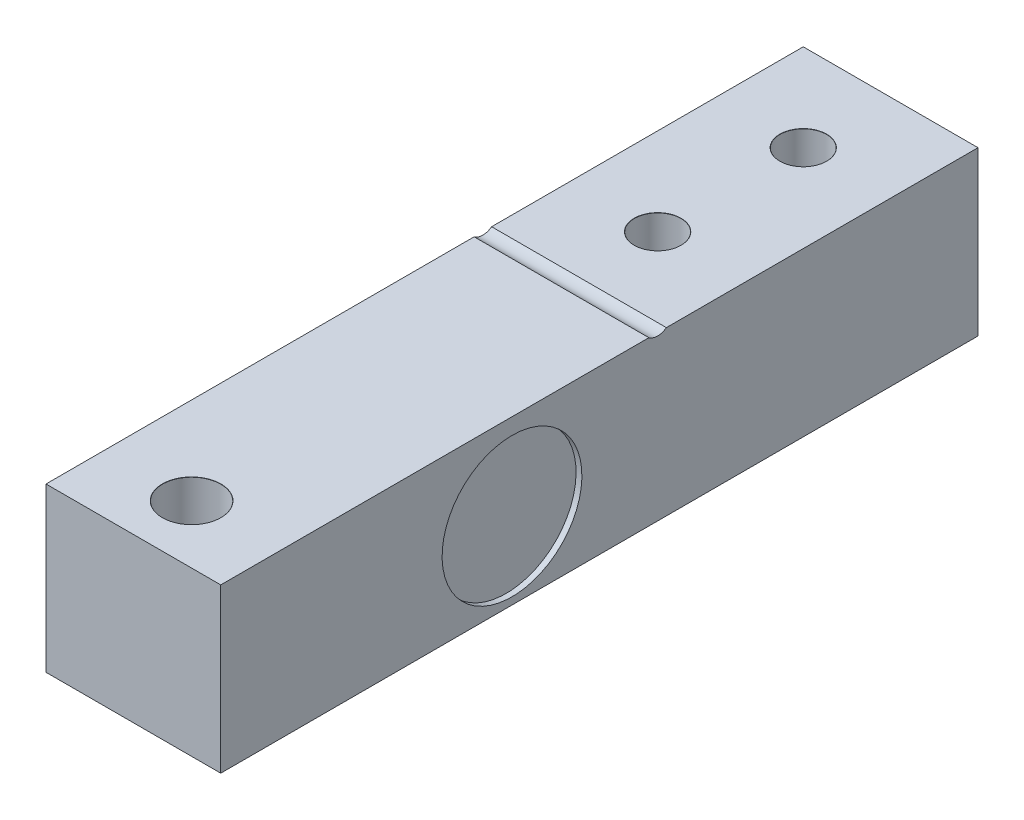
ISO-10303-21;
HEADER;
FILE_DESCRIPTION(('STEP AP214'),'2;1');
FILE_NAME('part.step','',(''),(''),'','','');
FILE_SCHEMA(('AUTOMOTIVE_DESIGN { 1 0 10303 214 1 1 1 1 }'));
ENDSEC;
DATA;
#1=APPLICATION_CONTEXT('core data for automotive mechanical design processes');
#2=APPLICATION_PROTOCOL_DEFINITION('international standard','automotive_design',2000,#1);
#3=PRODUCT_CONTEXT('',#1,'mechanical');
#4=PRODUCT('Part','Part','',(#3));
#5=PRODUCT_RELATED_PRODUCT_CATEGORY('part','',(#4));
#6=PRODUCT_DEFINITION_FORMATION('','',#4);
#7=PRODUCT_DEFINITION_CONTEXT('part definition',#1,'design');
#8=PRODUCT_DEFINITION('design','',#6,#7);
#9=PRODUCT_DEFINITION_SHAPE('','',#8);
#10=(LENGTH_UNIT() NAMED_UNIT(*) SI_UNIT(.MILLI.,.METRE.));
#11=(NAMED_UNIT(*) PLANE_ANGLE_UNIT() SI_UNIT($,.RADIAN.));
#12=(NAMED_UNIT(*) SI_UNIT($,.STERADIAN.) SOLID_ANGLE_UNIT());
#13=UNCERTAINTY_MEASURE_WITH_UNIT(LENGTH_MEASURE(1.E-05),#10,'distance_accuracy_value','');
#14=(GEOMETRIC_REPRESENTATION_CONTEXT(3) GLOBAL_UNCERTAINTY_ASSIGNED_CONTEXT((#13)) GLOBAL_UNIT_ASSIGNED_CONTEXT((#10,
#11,#12)) REPRESENTATION_CONTEXT('',''));
#15=CARTESIAN_POINT('',(0.,0.,0.));
#16=DIRECTION('',(0.,0.,1.));
#17=DIRECTION('',(1.,0.,0.));
#18=AXIS2_PLACEMENT_3D('',#15,#16,#17);
#19=CARTESIAN_POINT('',(-15.,14.,65.));
#20=DIRECTION('',(0.,-1.,0.));
#21=DIRECTION('',(0.,0.,-1.));
#22=AXIS2_PLACEMENT_3D('',#19,#20,#21);
#23=PLANE('',#22);
#24=CARTESIAN_POINT('',(0.,14.,55.));
#25=DIRECTION('',(0.,1.,0.));
#26=DIRECTION('',(0.,0.,1.));
#27=AXIS2_PLACEMENT_3D('',#24,#25,#26);
#28=CIRCLE('',#27,5.025);
#29=CARTESIAN_POINT('',(0.,14.,60.025));
#30=VERTEX_POINT('',#29);
#31=EDGE_CURVE('E156',#30,#30,#28,.T.);
#32=ORIENTED_EDGE('',*,*,#31,.F.);
#33=EDGE_LOOP('',(#32));
#34=FACE_BOUND('',#33,.T.);
#35=DIRECTION('',(0.,0.,-1.));
#36=VECTOR('',#35,1.);
#37=CARTESIAN_POINT('',(15.,14.,65.));
#38=LINE('',#37,#36);
#39=CARTESIAN_POINT('',(15.,14.,65.));
#40=VERTEX_POINT('',#39);
#41=CARTESIAN_POINT('',(15.,14.,-8.5));
#42=VERTEX_POINT('',#41);
#43=EDGE_CURVE('E44',#40,#42,#38,.T.);
#44=ORIENTED_EDGE('',*,*,#43,.T.);
#45=DIRECTION('',(-1.,0.,0.));
#46=VECTOR('',#45,1.);
#47=CARTESIAN_POINT('',(15.,14.,-8.5));
#48=LINE('',#47,#46);
#49=CARTESIAN_POINT('',(-15.,14.,-8.5));
#50=VERTEX_POINT('',#49);
#51=EDGE_CURVE('E96',#42,#50,#48,.T.);
#52=ORIENTED_EDGE('',*,*,#51,.T.);
#53=DIRECTION('',(0.,0.,-1.));
#54=VECTOR('',#53,1.);
#55=CARTESIAN_POINT('',(-15.,14.,65.));
#56=LINE('',#55,#54);
#57=CARTESIAN_POINT('',(-15.,14.,65.));
#58=VERTEX_POINT('',#57);
#59=EDGE_CURVE('E111',#58,#50,#56,.T.);
#60=ORIENTED_EDGE('',*,*,#59,.F.);
#61=DIRECTION('',(-1.,0.,0.));
#62=VECTOR('',#61,1.);
#63=CARTESIAN_POINT('',(-15.,14.,65.));
#64=LINE('',#63,#62);
#65=EDGE_CURVE('E88',#40,#58,#64,.T.);
#66=ORIENTED_EDGE('',*,*,#65,.F.);
#67=EDGE_LOOP('',(#44,#52,#60,#66));
#68=FACE_BOUND('',#67,.T.);
#69=ADVANCED_FACE('F36',(#34,#68),#23,.F.);
#70=CARTESIAN_POINT('',(15.,14.,65.));
#71=DIRECTION('',(-1.,0.,0.));
#72=DIRECTION('',(0.,-1.,0.));
#73=AXIS2_PLACEMENT_3D('',#70,#71,#72);
#74=PLANE('',#73);
#75=CARTESIAN_POINT('',(15.,-0.777034021146821,15.));
#76=DIRECTION('',(1.,0.,0.));
#77=DIRECTION('',(0.,1.,0.));
#78=AXIS2_PLACEMENT_3D('',#75,#76,#77);
#79=CIRCLE('',#78,12.);
#80=CARTESIAN_POINT('',(15.,11.2229659788532,15.));
#81=VERTEX_POINT('',#80);
#82=EDGE_CURVE('E166',#81,#81,#79,.T.);
#83=ORIENTED_EDGE('',*,*,#82,.F.);
#84=EDGE_LOOP('',(#83));
#85=FACE_BOUND('',#84,.T.);
#86=CARTESIAN_POINT('',(15.,14.,-11.5));
#87=VERTEX_POINT('',#86);
#88=CARTESIAN_POINT('',(15.,14.,-65.));
#89=VERTEX_POINT('',#88);
#90=EDGE_CURVE('E108',#87,#89,#38,.T.);
#91=ORIENTED_EDGE('',*,*,#90,.F.);
#92=CARTESIAN_POINT('',(15.,16.,-10.));
#93=DIRECTION('',(-1.,0.,0.));
#94=DIRECTION('',(0.,-1.,0.));
#95=AXIS2_PLACEMENT_3D('',#92,#93,#94);
#96=CIRCLE('',#95,2.5);
#97=EDGE_CURVE('E99',#87,#42,#96,.T.);
#98=ORIENTED_EDGE('',*,*,#97,.T.);
#99=ORIENTED_EDGE('',*,*,#43,.F.);
#100=DIRECTION('',(0.,1.,0.));
#101=VECTOR('',#100,1.);
#102=CARTESIAN_POINT('',(15.,14.,65.));
#103=LINE('',#102,#101);
#104=CARTESIAN_POINT('',(15.,-14.,65.));
#105=VERTEX_POINT('',#104);
#106=EDGE_CURVE('E120',#105,#40,#103,.T.);
#107=ORIENTED_EDGE('',*,*,#106,.F.);
#108=DIRECTION('',(0.,0.,-1.));
#109=VECTOR('',#108,1.);
#110=CARTESIAN_POINT('',(15.,-14.,65.));
#111=LINE('',#110,#109);
#112=CARTESIAN_POINT('',(15.,-14.,-65.));
#113=VERTEX_POINT('',#112);
#114=EDGE_CURVE('E117',#105,#113,#111,.T.);
#115=ORIENTED_EDGE('',*,*,#114,.T.);
#116=DIRECTION('',(0.,1.,0.));
#117=VECTOR('',#116,1.);
#118=CARTESIAN_POINT('',(15.,14.,-65.));
#119=LINE('',#118,#117);
#120=EDGE_CURVE('E101',#113,#89,#119,.T.);
#121=ORIENTED_EDGE('',*,*,#120,.T.);
#122=EDGE_LOOP('',(#91,#98,#99,#107,#115,#121));
#123=FACE_BOUND('',#122,.T.);
#124=ADVANCED_FACE('F38',(#85,#123),#74,.F.);
#125=CARTESIAN_POINT('',(0.,14.,-25.));
#126=DIRECTION('',(0.,1.,0.));
#127=DIRECTION('',(0.,0.,1.));
#128=AXIS2_PLACEMENT_3D('',#125,#126,#127);
#129=CIRCLE('',#128,4.025);
#130=CARTESIAN_POINT('',(0.,14.,-20.975));
#131=VERTEX_POINT('',#130);
#132=EDGE_CURVE('E147',#131,#131,#129,.T.);
#133=ORIENTED_EDGE('',*,*,#132,.F.);
#134=EDGE_LOOP('',(#133));
#135=FACE_BOUND('',#134,.T.);
#136=CARTESIAN_POINT('',(0.,14.,-50.));
#137=DIRECTION('',(0.,1.,0.));
#138=DIRECTION('',(0.,0.,1.));
#139=AXIS2_PLACEMENT_3D('',#136,#137,#138);
#140=CIRCLE('',#139,4.025);
#141=CARTESIAN_POINT('',(0.,14.,-45.975));
#142=VERTEX_POINT('',#141);
#143=EDGE_CURVE('E138',#142,#142,#140,.T.);
#144=ORIENTED_EDGE('',*,*,#143,.F.);
#145=EDGE_LOOP('',(#144));
#146=FACE_BOUND('',#145,.T.);
#147=CARTESIAN_POINT('',(-15.,14.,-11.5));
#148=VERTEX_POINT('',#147);
#149=CARTESIAN_POINT('',(-15.,14.,-65.));
#150=VERTEX_POINT('',#149);
#151=EDGE_CURVE('E114',#148,#150,#56,.T.);
#152=ORIENTED_EDGE('',*,*,#151,.F.);
#153=DIRECTION('',(-1.,0.,0.));
#154=VECTOR('',#153,1.);
#155=CARTESIAN_POINT('',(15.,14.,-11.5));
#156=LINE('',#155,#154);
#157=EDGE_CURVE('E51',#148,#87,#156,.F.);
#158=ORIENTED_EDGE('',*,*,#157,.T.);
#159=ORIENTED_EDGE('',*,*,#90,.T.);
#160=DIRECTION('',(-1.,0.,0.));
#161=VECTOR('',#160,1.);
#162=CARTESIAN_POINT('',(-15.,14.,-65.));
#163=LINE('',#162,#161);
#164=EDGE_CURVE('E123',#89,#150,#163,.T.);
#165=ORIENTED_EDGE('',*,*,#164,.T.);
#166=EDGE_LOOP('',(#152,#158,#159,#165));
#167=FACE_BOUND('',#166,.T.);
#168=ADVANCED_FACE('F182',(#135,#146,#167),#23,.F.);
#169=CARTESIAN_POINT('',(-15.,14.,65.));
#170=DIRECTION('',(1.,0.,0.));
#171=DIRECTION('',(0.,1.,0.));
#172=AXIS2_PLACEMENT_3D('',#169,#170,#171);
#173=PLANE('',#172);
#174=CARTESIAN_POINT('',(-15.,0.,15.));
#175=DIRECTION('',(-1.,0.,0.));
#176=DIRECTION('',(0.,-1.,0.));
#177=AXIS2_PLACEMENT_3D('',#174,#175,#176);
#178=CIRCLE('',#177,12.);
#179=CARTESIAN_POINT('',(-15.,-12.,15.));
#180=VERTEX_POINT('',#179);
#181=EDGE_CURVE('E160',#180,#180,#178,.T.);
#182=ORIENTED_EDGE('',*,*,#181,.F.);
#183=EDGE_LOOP('',(#182));
#184=FACE_BOUND('',#183,.T.);
#185=ORIENTED_EDGE('',*,*,#59,.T.);
#186=CARTESIAN_POINT('',(-15.,16.,-10.));
#187=DIRECTION('',(1.,0.,0.));
#188=DIRECTION('',(0.,1.,0.));
#189=AXIS2_PLACEMENT_3D('',#186,#187,#188);
#190=CIRCLE('',#189,2.5);
#191=EDGE_CURVE('E11',#50,#148,#190,.T.);
#192=ORIENTED_EDGE('',*,*,#191,.T.);
#193=ORIENTED_EDGE('',*,*,#151,.T.);
#194=DIRECTION('',(0.,-1.,0.));
#195=VECTOR('',#194,1.);
#196=CARTESIAN_POINT('',(-15.,14.,-65.));
#197=LINE('',#196,#195);
#198=CARTESIAN_POINT('',(-15.,-14.,-65.));
#199=VERTEX_POINT('',#198);
#200=EDGE_CURVE('E121',#150,#199,#197,.T.);
#201=ORIENTED_EDGE('',*,*,#200,.T.);
#202=DIRECTION('',(0.,0.,-1.));
#203=VECTOR('',#202,1.);
#204=CARTESIAN_POINT('',(-15.,-14.,65.));
#205=LINE('',#204,#203);
#206=CARTESIAN_POINT('',(-15.,-14.,65.));
#207=VERTEX_POINT('',#206);
#208=EDGE_CURVE('E115',#207,#199,#205,.T.);
#209=ORIENTED_EDGE('',*,*,#208,.F.);
#210=DIRECTION('',(0.,-1.,0.));
#211=VECTOR('',#210,1.);
#212=CARTESIAN_POINT('',(-15.,14.,65.));
#213=LINE('',#212,#211);
#214=EDGE_CURVE('E128',#58,#207,#213,.T.);
#215=ORIENTED_EDGE('',*,*,#214,.F.);
#216=EDGE_LOOP('',(#185,#192,#193,#201,#209,#215));
#217=FACE_BOUND('',#216,.T.);
#218=ADVANCED_FACE('F187',(#184,#217),#173,.F.);
#219=CARTESIAN_POINT('',(-15.,-14.,65.));
#220=DIRECTION('',(0.,1.,0.));
#221=DIRECTION('',(0.,0.,1.));
#222=AXIS2_PLACEMENT_3D('',#219,#220,#221);
#223=PLANE('',#222);
#224=CARTESIAN_POINT('',(0.,-14.,55.));
#225=DIRECTION('',(0.,1.,0.));
#226=DIRECTION('',(0.,0.,1.));
#227=AXIS2_PLACEMENT_3D('',#224,#225,#226);
#228=CIRCLE('',#227,5.);
#229=CARTESIAN_POINT('',(0.,-14.,60.));
#230=VERTEX_POINT('',#229);
#231=EDGE_CURVE('E150',#230,#230,#228,.T.);
#232=ORIENTED_EDGE('',*,*,#231,.T.);
#233=EDGE_LOOP('',(#232));
#234=FACE_BOUND('',#233,.T.);
#235=CARTESIAN_POINT('',(0.,-14.,-25.));
#236=DIRECTION('',(0.,1.,0.));
#237=DIRECTION('',(0.,0.,1.));
#238=AXIS2_PLACEMENT_3D('',#235,#236,#237);
#239=CIRCLE('',#238,4.);
#240=CARTESIAN_POINT('',(0.,-14.,-21.));
#241=VERTEX_POINT('',#240);
#242=EDGE_CURVE('E141',#241,#241,#239,.T.);
#243=ORIENTED_EDGE('',*,*,#242,.T.);
#244=EDGE_LOOP('',(#243));
#245=FACE_BOUND('',#244,.T.);
#246=CARTESIAN_POINT('',(0.,-14.,-50.));
#247=DIRECTION('',(0.,1.,0.));
#248=DIRECTION('',(0.,0.,1.));
#249=AXIS2_PLACEMENT_3D('',#246,#247,#248);
#250=CIRCLE('',#249,4.);
#251=CARTESIAN_POINT('',(0.,-14.,-46.));
#252=VERTEX_POINT('',#251);
#253=EDGE_CURVE('E109',#252,#252,#250,.T.);
#254=ORIENTED_EDGE('',*,*,#253,.T.);
#255=EDGE_LOOP('',(#254));
#256=FACE_BOUND('',#255,.T.);
#257=DIRECTION('',(1.,0.,0.));
#258=VECTOR('',#257,1.);
#259=CARTESIAN_POINT('',(-15.,-14.,-65.));
#260=LINE('',#259,#258);
#261=EDGE_CURVE('E80',#199,#113,#260,.T.);
#262=ORIENTED_EDGE('',*,*,#261,.T.);
#263=ORIENTED_EDGE('',*,*,#114,.F.);
#264=DIRECTION('',(1.,0.,0.));
#265=VECTOR('',#264,1.);
#266=CARTESIAN_POINT('',(-15.,-14.,65.));
#267=LINE('',#266,#265);
#268=EDGE_CURVE('E59',#207,#105,#267,.T.);
#269=ORIENTED_EDGE('',*,*,#268,.F.);
#270=ORIENTED_EDGE('',*,*,#208,.T.);
#271=EDGE_LOOP('',(#262,#263,#269,#270));
#272=FACE_BOUND('',#271,.T.);
#273=ADVANCED_FACE('F196',(#234,#245,#256,#272),#223,.F.);
#274=CARTESIAN_POINT('',(0.,0.,65.));
#275=DIRECTION('',(0.,0.,1.));
#276=DIRECTION('',(1.,0.,0.));
#277=AXIS2_PLACEMENT_3D('',#274,#275,#276);
#278=PLANE('',#277);
#279=ORIENTED_EDGE('',*,*,#106,.T.);
#280=ORIENTED_EDGE('',*,*,#65,.T.);
#281=ORIENTED_EDGE('',*,*,#214,.T.);
#282=ORIENTED_EDGE('',*,*,#268,.T.);
#283=EDGE_LOOP('',(#279,#280,#281,#282));
#284=FACE_BOUND('',#283,.T.);
#285=ADVANCED_FACE('F200',(#284),#278,.T.);
#286=CARTESIAN_POINT('',(0.,0.,-65.));
#287=DIRECTION('',(0.,0.,1.));
#288=DIRECTION('',(1.,0.,0.));
#289=AXIS2_PLACEMENT_3D('',#286,#287,#288);
#290=PLANE('',#289);
#291=ORIENTED_EDGE('',*,*,#120,.F.);
#292=ORIENTED_EDGE('',*,*,#261,.F.);
#293=ORIENTED_EDGE('',*,*,#200,.F.);
#294=ORIENTED_EDGE('',*,*,#164,.F.);
#295=EDGE_LOOP('',(#291,#292,#293,#294));
#296=FACE_BOUND('',#295,.T.);
#297=ADVANCED_FACE('F202',(#296),#290,.F.);
#298=CARTESIAN_POINT('',(15.,16.,-10.));
#299=DIRECTION('',(-1.,0.,0.));
#300=DIRECTION('',(0.,-1.,0.));
#301=AXIS2_PLACEMENT_3D('',#298,#299,#300);
#302=CYLINDRICAL_SURFACE('',#301,2.5);
#303=ORIENTED_EDGE('',*,*,#97,.F.);
#304=ORIENTED_EDGE('',*,*,#157,.F.);
#305=ORIENTED_EDGE('',*,*,#191,.F.);
#306=ORIENTED_EDGE('',*,*,#51,.F.);
#307=EDGE_LOOP('',(#303,#304,#305,#306));
#308=FACE_BOUND('',#307,.T.);
#309=ADVANCED_FACE('F98',(#308),#302,.F.);
#310=CARTESIAN_POINT('',(0.,14.,-50.));
#311=DIRECTION('',(0.,1.,0.));
#312=DIRECTION('',(0.,0.,1.));
#313=AXIS2_PLACEMENT_3D('',#310,#311,#312);
#314=CYLINDRICAL_SURFACE('',#313,4.);
#315=ORIENTED_EDGE('',*,*,#253,.F.);
#316=EDGE_LOOP('',(#315));
#317=FACE_BOUND('',#316,.T.);
#318=CARTESIAN_POINT('',(0.,13.975,-50.));
#319=DIRECTION('',(0.,1.,0.));
#320=DIRECTION('',(0.,0.,1.));
#321=AXIS2_PLACEMENT_3D('',#318,#319,#320);
#322=CIRCLE('',#321,4.);
#323=CARTESIAN_POINT('',(0.,13.975,-46.));
#324=VERTEX_POINT('',#323);
#325=EDGE_CURVE('E135',#324,#324,#322,.T.);
#326=ORIENTED_EDGE('',*,*,#325,.T.);
#327=EDGE_LOOP('',(#326));
#328=FACE_BOUND('',#327,.T.);
#329=ADVANCED_FACE('F210',(#317,#328),#314,.F.);
#330=CARTESIAN_POINT('',(0.,14.,-50.));
#331=DIRECTION('',(0.,1.,0.));
#332=DIRECTION('',(0.,0.,1.));
#333=AXIS2_PLACEMENT_3D('',#330,#331,#332);
#334=CONICAL_SURFACE('',#333,4.025,0.785398163397448);
#335=ORIENTED_EDGE('',*,*,#325,.F.);
#336=EDGE_LOOP('',(#335));
#337=FACE_BOUND('',#336,.T.);
#338=ORIENTED_EDGE('',*,*,#143,.T.);
#339=EDGE_LOOP('',(#338));
#340=FACE_BOUND('',#339,.T.);
#341=ADVANCED_FACE('F213',(#337,#340),#334,.F.);
#342=CARTESIAN_POINT('',(0.,14.,-25.));
#343=DIRECTION('',(0.,1.,0.));
#344=DIRECTION('',(0.,0.,1.));
#345=AXIS2_PLACEMENT_3D('',#342,#343,#344);
#346=CYLINDRICAL_SURFACE('',#345,4.);
#347=ORIENTED_EDGE('',*,*,#242,.F.);
#348=EDGE_LOOP('',(#347));
#349=FACE_BOUND('',#348,.T.);
#350=CARTESIAN_POINT('',(0.,13.975,-25.));
#351=DIRECTION('',(0.,1.,0.));
#352=DIRECTION('',(0.,0.,1.));
#353=AXIS2_PLACEMENT_3D('',#350,#351,#352);
#354=CIRCLE('',#353,4.);
#355=CARTESIAN_POINT('',(0.,13.975,-21.));
#356=VERTEX_POINT('',#355);
#357=EDGE_CURVE('E144',#356,#356,#354,.T.);
#358=ORIENTED_EDGE('',*,*,#357,.T.);
#359=EDGE_LOOP('',(#358));
#360=FACE_BOUND('',#359,.T.);
#361=ADVANCED_FACE('F217',(#349,#360),#346,.F.);
#362=CARTESIAN_POINT('',(0.,14.,-25.));
#363=DIRECTION('',(0.,1.,0.));
#364=DIRECTION('',(0.,0.,1.));
#365=AXIS2_PLACEMENT_3D('',#362,#363,#364);
#366=CONICAL_SURFACE('',#365,4.025,0.785398163397448);
#367=ORIENTED_EDGE('',*,*,#357,.F.);
#368=EDGE_LOOP('',(#367));
#369=FACE_BOUND('',#368,.T.);
#370=ORIENTED_EDGE('',*,*,#132,.T.);
#371=EDGE_LOOP('',(#370));
#372=FACE_BOUND('',#371,.T.);
#373=ADVANCED_FACE('F221',(#369,#372),#366,.F.);
#374=CARTESIAN_POINT('',(0.,14.,55.));
#375=DIRECTION('',(0.,1.,0.));
#376=DIRECTION('',(0.,0.,1.));
#377=AXIS2_PLACEMENT_3D('',#374,#375,#376);
#378=CYLINDRICAL_SURFACE('',#377,5.);
#379=ORIENTED_EDGE('',*,*,#231,.F.);
#380=EDGE_LOOP('',(#379));
#381=FACE_BOUND('',#380,.T.);
#382=CARTESIAN_POINT('',(0.,13.975,55.));
#383=DIRECTION('',(0.,1.,0.));
#384=DIRECTION('',(0.,0.,1.));
#385=AXIS2_PLACEMENT_3D('',#382,#383,#384);
#386=CIRCLE('',#385,5.);
#387=CARTESIAN_POINT('',(0.,13.975,60.));
#388=VERTEX_POINT('',#387);
#389=EDGE_CURVE('E153',#388,#388,#386,.T.);
#390=ORIENTED_EDGE('',*,*,#389,.T.);
#391=EDGE_LOOP('',(#390));
#392=FACE_BOUND('',#391,.T.);
#393=ADVANCED_FACE('F225',(#381,#392),#378,.F.);
#394=CARTESIAN_POINT('',(0.,14.,55.));
#395=DIRECTION('',(0.,1.,0.));
#396=DIRECTION('',(0.,0.,1.));
#397=AXIS2_PLACEMENT_3D('',#394,#395,#396);
#398=CONICAL_SURFACE('',#397,5.025,0.785398163397414);
#399=ORIENTED_EDGE('',*,*,#389,.F.);
#400=EDGE_LOOP('',(#399));
#401=FACE_BOUND('',#400,.T.);
#402=ORIENTED_EDGE('',*,*,#31,.T.);
#403=EDGE_LOOP('',(#402));
#404=FACE_BOUND('',#403,.T.);
#405=ADVANCED_FACE('F229',(#401,#404),#398,.F.);
#406=CARTESIAN_POINT('',(-14.,0.,15.));
#407=DIRECTION('',(-1.,0.,0.));
#408=DIRECTION('',(0.,-1.,0.));
#409=AXIS2_PLACEMENT_3D('',#406,#407,#408);
#410=CYLINDRICAL_SURFACE('',#409,12.);
#411=CARTESIAN_POINT('',(-14.,0.,15.));
#412=DIRECTION('',(-1.,0.,0.));
#413=DIRECTION('',(0.,-1.,0.));
#414=AXIS2_PLACEMENT_3D('',#411,#412,#413);
#415=CIRCLE('',#414,12.);
#416=CARTESIAN_POINT('',(-14.,-12.,15.));
#417=VERTEX_POINT('',#416);
#418=EDGE_CURVE('E159',#417,#417,#415,.T.);
#419=ORIENTED_EDGE('',*,*,#418,.F.);
#420=EDGE_LOOP('',(#419));
#421=FACE_BOUND('',#420,.T.);
#422=ORIENTED_EDGE('',*,*,#181,.T.);
#423=EDGE_LOOP('',(#422));
#424=FACE_BOUND('',#423,.T.);
#425=ADVANCED_FACE('F233',(#421,#424),#410,.F.);
#426=CARTESIAN_POINT('',(-14.,0.,15.));
#427=DIRECTION('',(-1.,0.,0.));
#428=DIRECTION('',(0.,-1.,0.));
#429=AXIS2_PLACEMENT_3D('',#426,#427,#428);
#430=PLANE('',#429);
#431=ORIENTED_EDGE('',*,*,#418,.T.);
#432=EDGE_LOOP('',(#431));
#433=FACE_BOUND('',#432,.T.);
#434=ADVANCED_FACE('F177',(#433),#430,.T.);
#435=CARTESIAN_POINT('',(14.,-0.777034021146821,15.));
#436=DIRECTION('',(1.,0.,0.));
#437=DIRECTION('',(0.,1.,0.));
#438=AXIS2_PLACEMENT_3D('',#435,#436,#437);
#439=CYLINDRICAL_SURFACE('',#438,12.);
#440=CARTESIAN_POINT('',(14.,-0.777034021146821,15.));
#441=DIRECTION('',(1.,0.,0.));
#442=DIRECTION('',(0.,1.,0.));
#443=AXIS2_PLACEMENT_3D('',#440,#441,#442);
#444=CIRCLE('',#443,12.);
#445=CARTESIAN_POINT('',(14.,11.2229659788532,15.));
#446=VERTEX_POINT('',#445);
#447=EDGE_CURVE('E163',#446,#446,#444,.T.);
#448=ORIENTED_EDGE('',*,*,#447,.F.);
#449=EDGE_LOOP('',(#448));
#450=FACE_BOUND('',#449,.T.);
#451=ORIENTED_EDGE('',*,*,#82,.T.);
#452=EDGE_LOOP('',(#451));
#453=FACE_BOUND('',#452,.T.);
#454=ADVANCED_FACE('F174',(#450,#453),#439,.F.);
#455=CARTESIAN_POINT('',(14.,-0.777034021146821,15.));
#456=DIRECTION('',(1.,0.,0.));
#457=DIRECTION('',(0.,1.,0.));
#458=AXIS2_PLACEMENT_3D('',#455,#456,#457);
#459=PLANE('',#458);
#460=ORIENTED_EDGE('',*,*,#447,.T.);
#461=EDGE_LOOP('',(#460));
#462=FACE_BOUND('',#461,.T.);
#463=ADVANCED_FACE('F172',(#462),#459,.T.);
#464=CLOSED_SHELL('',(#69,#124,#168,#218,#273,#285,#297,#309,#329,#341,#361,#373,#393,#405,#425,
#434,#454,#463));
#465=MANIFOLD_SOLID_BREP('B2',#464);
#466=ADVANCED_BREP_SHAPE_REPRESENTATION('',(#18,#465),#14);
#467=SHAPE_DEFINITION_REPRESENTATION(#9,#466);
ENDSEC;
END-ISO-10303-21;
